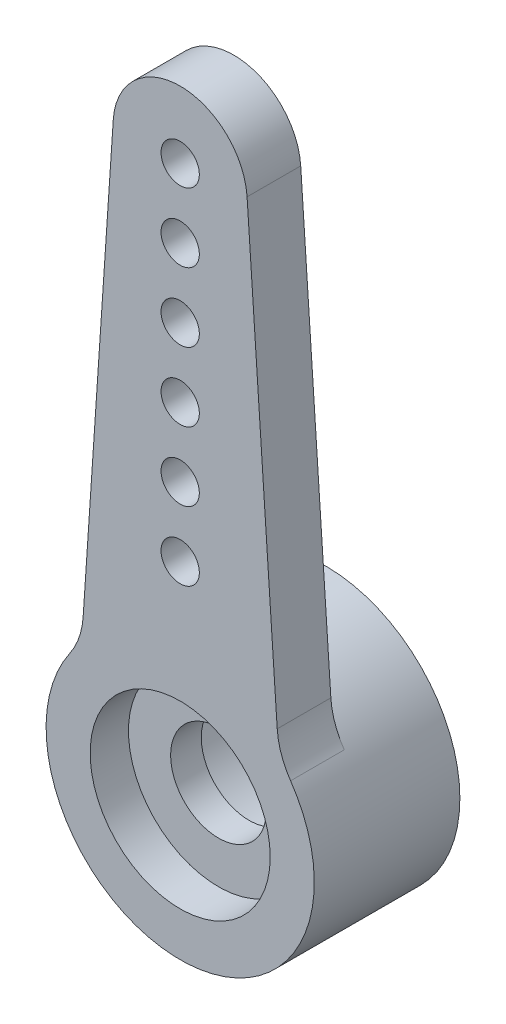
ISO-10303-21;
HEADER;
FILE_DESCRIPTION(('STEP AP214'),'2;1');
FILE_NAME('part.step','',(''),(''),'','','');
FILE_SCHEMA(('AUTOMOTIVE_DESIGN { 1 0 10303 214 1 1 1 1 }'));
ENDSEC;
DATA;
#1=APPLICATION_CONTEXT('core data for automotive mechanical design processes');
#2=APPLICATION_PROTOCOL_DEFINITION('international standard','automotive_design',2000,#1);
#3=PRODUCT_CONTEXT('',#1,'mechanical');
#4=PRODUCT('Part','Part','',(#3));
#5=PRODUCT_RELATED_PRODUCT_CATEGORY('part','',(#4));
#6=PRODUCT_DEFINITION_FORMATION('','',#4);
#7=PRODUCT_DEFINITION_CONTEXT('part definition',#1,'design');
#8=PRODUCT_DEFINITION('design','',#6,#7);
#9=PRODUCT_DEFINITION_SHAPE('','',#8);
#10=(LENGTH_UNIT() NAMED_UNIT(*) SI_UNIT(.MILLI.,.METRE.));
#11=(NAMED_UNIT(*) PLANE_ANGLE_UNIT() SI_UNIT($,.RADIAN.));
#12=(NAMED_UNIT(*) SI_UNIT($,.STERADIAN.) SOLID_ANGLE_UNIT());
#13=UNCERTAINTY_MEASURE_WITH_UNIT(LENGTH_MEASURE(1.E-05),#10,'distance_accuracy_value','');
#14=(GEOMETRIC_REPRESENTATION_CONTEXT(3) GLOBAL_UNCERTAINTY_ASSIGNED_CONTEXT((#13)) GLOBAL_UNIT_ASSIGNED_CONTEXT((#10,
#11,#12)) REPRESENTATION_CONTEXT('',''));
#15=CARTESIAN_POINT('',(0.,0.,0.));
#16=DIRECTION('',(0.,0.,1.));
#17=DIRECTION('',(1.,0.,0.));
#18=AXIS2_PLACEMENT_3D('',#15,#16,#17);
#19=CARTESIAN_POINT('',(0.,0.,3.8));
#20=DIRECTION('',(0.,0.,-1.));
#21=DIRECTION('',(-1.,0.,0.));
#22=AXIS2_PLACEMENT_3D('',#19,#20,#21);
#23=CYLINDRICAL_SURFACE('',#22,1.25);
#24=CARTESIAN_POINT('',(0.,0.,2.8));
#25=DIRECTION('',(0.,0.,1.));
#26=DIRECTION('',(1.,0.,0.));
#27=AXIS2_PLACEMENT_3D('',#24,#25,#26);
#28=CIRCLE('',#27,1.25);
#29=CARTESIAN_POINT('',(-1.25,0.,2.8));
#30=VERTEX_POINT('',#29);
#31=EDGE_CURVE('E148',#30,#30,#28,.T.);
#32=CARTESIAN_POINT('',(0.,0.,2.));
#33=DIRECTION('',(0.,0.,-1.));
#34=DIRECTION('',(-1.,0.,0.));
#35=AXIS2_PLACEMENT_3D('',#32,#33,#34);
#36=CIRCLE('',#35,1.25);
#37=CARTESIAN_POINT('',(-1.25,0.,2.));
#38=VERTEX_POINT('',#37);
#39=EDGE_CURVE('E154',#38,#38,#36,.T.);
#40=CARTESIAN_POINT('',(-1.25,0.,2.8));
#41=CARTESIAN_POINT('',(-1.25,0.,2.79166666666667));
#42=CARTESIAN_POINT('',(-1.25,0.,2.78333333333333));
#43=CARTESIAN_POINT('',(-1.25,0.,2.76666666666667));
#44=CARTESIAN_POINT('',(-1.25,0.,2.75833333333333));
#45=CARTESIAN_POINT('',(-1.25,0.,2.74166666666667));
#46=CARTESIAN_POINT('',(-1.25,0.,2.73333333333333));
#47=CARTESIAN_POINT('',(-1.25,0.,2.71666666666667));
#48=CARTESIAN_POINT('',(-1.25,0.,2.70833333333333));
#49=CARTESIAN_POINT('',(-1.25,0.,2.69166666666667));
#50=CARTESIAN_POINT('',(-1.25,0.,2.68333333333333));
#51=CARTESIAN_POINT('',(-1.25,0.,2.66666666666667));
#52=CARTESIAN_POINT('',(-1.25,0.,2.65833333333333));
#53=CARTESIAN_POINT('',(-1.25,0.,2.64166666666667));
#54=CARTESIAN_POINT('',(-1.25,0.,2.63333333333333));
#55=CARTESIAN_POINT('',(-1.25,0.,2.61666666666667));
#56=CARTESIAN_POINT('',(-1.25,0.,2.60833333333333));
#57=CARTESIAN_POINT('',(-1.25,0.,2.59166666666667));
#58=CARTESIAN_POINT('',(-1.25,0.,2.58333333333333));
#59=CARTESIAN_POINT('',(-1.25,0.,2.56666666666667));
#60=CARTESIAN_POINT('',(-1.25,0.,2.55833333333333));
#61=CARTESIAN_POINT('',(-1.25,0.,2.54166666666667));
#62=CARTESIAN_POINT('',(-1.25,0.,2.53333333333333));
#63=CARTESIAN_POINT('',(-1.25,0.,2.51666666666667));
#64=CARTESIAN_POINT('',(-1.25,0.,2.50833333333333));
#65=CARTESIAN_POINT('',(-1.25,0.,2.49166666666667));
#66=CARTESIAN_POINT('',(-1.25,0.,2.48333333333333));
#67=CARTESIAN_POINT('',(-1.25,0.,2.46666666666667));
#68=CARTESIAN_POINT('',(-1.25,0.,2.45833333333333));
#69=CARTESIAN_POINT('',(-1.25,0.,2.44166666666667));
#70=CARTESIAN_POINT('',(-1.25,0.,2.43333333333333));
#71=CARTESIAN_POINT('',(-1.25,0.,2.41666666666667));
#72=CARTESIAN_POINT('',(-1.25,0.,2.40833333333333));
#73=CARTESIAN_POINT('',(-1.25,0.,2.39166666666667));
#74=CARTESIAN_POINT('',(-1.25,0.,2.38333333333333));
#75=CARTESIAN_POINT('',(-1.25,0.,2.36666666666667));
#76=CARTESIAN_POINT('',(-1.25,0.,2.35833333333333));
#77=CARTESIAN_POINT('',(-1.25,0.,2.34166666666667));
#78=CARTESIAN_POINT('',(-1.25,0.,2.33333333333333));
#79=CARTESIAN_POINT('',(-1.25,0.,2.31666666666667));
#80=CARTESIAN_POINT('',(-1.25,0.,2.30833333333333));
#81=CARTESIAN_POINT('',(-1.25,0.,2.29166666666667));
#82=CARTESIAN_POINT('',(-1.25,0.,2.28333333333333));
#83=CARTESIAN_POINT('',(-1.25,0.,2.26666666666667));
#84=CARTESIAN_POINT('',(-1.25,0.,2.25833333333333));
#85=CARTESIAN_POINT('',(-1.25,0.,2.24166666666667));
#86=CARTESIAN_POINT('',(-1.25,0.,2.23333333333333));
#87=CARTESIAN_POINT('',(-1.25,0.,2.21666666666667));
#88=CARTESIAN_POINT('',(-1.25,0.,2.20833333333333));
#89=CARTESIAN_POINT('',(-1.25,0.,2.19166666666667));
#90=CARTESIAN_POINT('',(-1.25,0.,2.18333333333333));
#91=CARTESIAN_POINT('',(-1.25,0.,2.16666666666667));
#92=CARTESIAN_POINT('',(-1.25,0.,2.15833333333333));
#93=CARTESIAN_POINT('',(-1.25,0.,2.14166666666667));
#94=CARTESIAN_POINT('',(-1.25,0.,2.13333333333333));
#95=CARTESIAN_POINT('',(-1.25,0.,2.11666666666667));
#96=CARTESIAN_POINT('',(-1.25,0.,2.10833333333333));
#97=CARTESIAN_POINT('',(-1.25,0.,2.09166666666667));
#98=CARTESIAN_POINT('',(-1.25,0.,2.08333333333333));
#99=CARTESIAN_POINT('',(-1.25,0.,2.06666666666667));
#100=CARTESIAN_POINT('',(-1.25,0.,2.05833333333333));
#101=CARTESIAN_POINT('',(-1.25,0.,2.04166666666667));
#102=CARTESIAN_POINT('',(-1.25,0.,2.03333333333333));
#103=CARTESIAN_POINT('',(-1.25,0.,2.01666666666667));
#104=CARTESIAN_POINT('',(-1.25,0.,2.00833333333333));
#105=CARTESIAN_POINT('',(-1.25,0.,2.));
#106=B_SPLINE_CURVE_WITH_KNOTS('',3,(#40,#41,#42,#43,#44,#45,#46,#47,#48,#49,#50,#51,#52,#53,
#54,#55,#56,#57,#58,#59,#60,#61,#62,#63,#64,#65,#66,#67,#68,#69,#70,#71,#72,#73,#74,#75,#76,#77,
#78,#79,#80,#81,#82,#83,#84,#85,#86,#87,#88,#89,#90,#91,#92,#93,#94,#95,#96,#97,#98,#99,#100,
#101,#102,#103,#104,#105),.UNSPECIFIED.,.F.,.F.,(4,2,2,2,2,2,2,2,2,2,2,2,2,2,2,2,2,2,2,2,2,2,2,
2,2,2,2,2,2,2,2,2,4),(0.,0.0249999999999998,0.0499999999999997,0.0749999999999995,
0.0999999999999994,0.125,0.15,0.175,0.2,0.225,0.249999999999999,0.275,0.3,0.325,0.35,
0.374999999999999,0.399999999999999,0.424999999999999,0.449999999999999,0.475,0.5,
0.524999999999999,0.549999999999999,0.574999999999999,0.599999999999999,0.625,0.65,
0.674999999999999,0.699999999999999,0.724999999999999,0.749999999999999,0.775,
0.799999999999999),.UNSPECIFIED.);
#107=EDGE_CURVE('BSEAM39',#30,#38,#106,.T.);
#108=ORIENTED_EDGE('',*,*,#31,.T.);
#109=ORIENTED_EDGE('',*,*,#39,.T.);
#110=ORIENTED_EDGE('',*,*,#107,.T.);
#111=ORIENTED_EDGE('',*,*,#107,.F.);
#112=EDGE_LOOP('',(#108,#110,#109,#111));
#113=FACE_BOUND('',#112,.T.);
#114=ADVANCED_FACE('F39',(#113),#23,.F.);
#115=CARTESIAN_POINT('',(0.,0.,3.8));
#116=DIRECTION('',(0.,0.,1.));
#117=DIRECTION('',(1.,0.,0.));
#118=AXIS2_PLACEMENT_3D('',#115,#116,#117);
#119=PLANE('',#118);
#120=CARTESIAN_POINT('',(0.,0.,3.8));
#121=DIRECTION('',(0.,0.,1.));
#122=DIRECTION('',(1.,0.,0.));
#123=AXIS2_PLACEMENT_3D('',#120,#121,#122);
#124=CIRCLE('',#123,2.35);
#125=CARTESIAN_POINT('',(2.35,0.,3.8));
#126=VERTEX_POINT('',#125);
#127=EDGE_CURVE('E158',#126,#126,#124,.T.);
#128=ORIENTED_EDGE('',*,*,#127,.F.);
#129=EDGE_LOOP('',(#128));
#130=FACE_BOUND('',#129,.T.);
#131=DIRECTION('',(-0.0674688051263375,-0.997721384122253,0.));
#132=VECTOR('',#131,1.);
#133=CARTESIAN_POINT('',(-2.65,1.25,3.8));
#134=LINE('',#133,#132);
#135=CARTESIAN_POINT('',(-1.74601242221394,14.6180704089711,3.8));
#136=VERTEX_POINT('',#135);
#137=CARTESIAN_POINT('',(-2.53252839434501,2.98715738361887,3.8));
#138=VERTEX_POINT('',#137);
#139=EDGE_CURVE('E98',#136,#138,#134,.T.);
#140=ORIENTED_EDGE('',*,*,#139,.T.);
#141=CARTESIAN_POINT('',(-4.52797116258952,3.12209499387154,3.8));
#142=DIRECTION('',(0.,0.,1.));
#143=DIRECTION('',(1.,0.,0.));
#144=AXIS2_PLACEMENT_3D('',#141,#142,#143);
#145=CIRCLE('',#144,2.);
#146=CARTESIAN_POINT('',(-2.88143619437515,1.9867877233728,3.8));
#147=VERTEX_POINT('',#146);
#148=EDGE_CURVE('E174',#138,#147,#145,.F.);
#149=ORIENTED_EDGE('',*,*,#148,.T.);
#150=CARTESIAN_POINT('',(0.,0.,3.8));
#151=DIRECTION('',(0.,0.,1.));
#152=DIRECTION('',(1.,0.,0.));
#153=AXIS2_PLACEMENT_3D('',#150,#151,#152);
#154=CIRCLE('',#153,3.5);
#155=CARTESIAN_POINT('',(2.88143619437515,1.9867877233728,3.8));
#156=VERTEX_POINT('',#155);
#157=EDGE_CURVE('E141',#147,#156,#154,.T.);
#158=ORIENTED_EDGE('',*,*,#157,.T.);
#159=CARTESIAN_POINT('',(4.52797116258952,3.12209499387154,3.8));
#160=DIRECTION('',(0.,0.,1.));
#161=DIRECTION('',(1.,0.,0.));
#162=AXIS2_PLACEMENT_3D('',#159,#160,#161);
#163=CIRCLE('',#162,2.);
#164=CARTESIAN_POINT('',(2.53252839434501,2.98715738361887,3.8));
#165=VERTEX_POINT('',#164);
#166=EDGE_CURVE('E48',#156,#165,#163,.F.);
#167=ORIENTED_EDGE('',*,*,#166,.T.);
#168=DIRECTION('',(-0.0674688051263375,0.997721384122253,0.));
#169=VECTOR('',#168,1.);
#170=CARTESIAN_POINT('',(2.65,1.25,3.8));
#171=LINE('',#170,#169);
#172=CARTESIAN_POINT('',(1.74601242221394,14.6180704089711,3.8));
#173=VERTEX_POINT('',#172);
#174=EDGE_CURVE('E119',#165,#173,#171,.T.);
#175=ORIENTED_EDGE('',*,*,#174,.T.);
#176=CARTESIAN_POINT('',(0.,14.5,3.8));
#177=DIRECTION('',(0.,0.,1.));
#178=DIRECTION('',(1.,0.,0.));
#179=AXIS2_PLACEMENT_3D('',#176,#177,#178);
#180=CIRCLE('',#179,1.75);
#181=EDGE_CURVE('E129',#173,#136,#180,.T.);
#182=ORIENTED_EDGE('',*,*,#181,.T.);
#183=EDGE_LOOP('',(#140,#149,#158,#167,#175,#182));
#184=FACE_BOUND('',#183,.T.);
#185=CARTESIAN_POINT('',(1.00995535406375E-13,5.5,3.8));
#186=DIRECTION('',(0.,0.,1.));
#187=DIRECTION('',(1.,0.,0.));
#188=AXIS2_PLACEMENT_3D('',#185,#186,#187);
#189=CIRCLE('',#188,0.5);
#190=CARTESIAN_POINT('',(0.500000000000101,5.5,3.8));
#191=VERTEX_POINT('',#190);
#192=EDGE_CURVE('E152',#191,#191,#189,.T.);
#193=ORIENTED_EDGE('',*,*,#192,.F.);
#194=EDGE_LOOP('',(#193));
#195=FACE_BOUND('',#194,.T.);
#196=CARTESIAN_POINT('',(0.,7.3,3.8));
#197=DIRECTION('',(0.,0.,1.));
#198=DIRECTION('',(1.,0.,0.));
#199=AXIS2_PLACEMENT_3D('',#196,#197,#198);
#200=CIRCLE('',#199,0.5);
#201=CARTESIAN_POINT('',(0.500000000000076,7.3,3.8));
#202=VERTEX_POINT('',#201);
#203=EDGE_CURVE('E284',#202,#202,#200,.T.);
#204=ORIENTED_EDGE('',*,*,#203,.F.);
#205=EDGE_LOOP('',(#204));
#206=FACE_BOUND('',#205,.T.);
#207=CARTESIAN_POINT('',(0.,9.1,3.8));
#208=DIRECTION('',(0.,0.,1.));
#209=DIRECTION('',(1.,0.,0.));
#210=AXIS2_PLACEMENT_3D('',#207,#208,#209);
#211=CIRCLE('',#210,0.5);
#212=CARTESIAN_POINT('',(0.500000000000051,9.1,3.8));
#213=VERTEX_POINT('',#212);
#214=EDGE_CURVE('E292',#213,#213,#211,.T.);
#215=ORIENTED_EDGE('',*,*,#214,.F.);
#216=EDGE_LOOP('',(#215));
#217=FACE_BOUND('',#216,.T.);
#218=CARTESIAN_POINT('',(0.,10.9,3.8));
#219=DIRECTION('',(0.,0.,1.));
#220=DIRECTION('',(1.,0.,0.));
#221=AXIS2_PLACEMENT_3D('',#218,#219,#220);
#222=CIRCLE('',#221,0.5);
#223=CARTESIAN_POINT('',(0.500000000000026,10.9,3.8));
#224=VERTEX_POINT('',#223);
#225=EDGE_CURVE('E300',#224,#224,#222,.T.);
#226=ORIENTED_EDGE('',*,*,#225,.F.);
#227=EDGE_LOOP('',(#226));
#228=FACE_BOUND('',#227,.T.);
#229=CARTESIAN_POINT('',(0.,12.7,3.8));
#230=DIRECTION('',(0.,0.,1.));
#231=DIRECTION('',(1.,0.,0.));
#232=AXIS2_PLACEMENT_3D('',#229,#230,#231);
#233=CIRCLE('',#232,0.5);
#234=CARTESIAN_POINT('',(0.5,12.7,3.8));
#235=VERTEX_POINT('',#234);
#236=EDGE_CURVE('E308',#235,#235,#233,.T.);
#237=ORIENTED_EDGE('',*,*,#236,.F.);
#238=EDGE_LOOP('',(#237));
#239=FACE_BOUND('',#238,.T.);
#240=CARTESIAN_POINT('',(0.,14.5,3.8));
#241=DIRECTION('',(0.,0.,1.));
#242=DIRECTION('',(1.,0.,0.));
#243=AXIS2_PLACEMENT_3D('',#240,#241,#242);
#244=CIRCLE('',#243,0.5);
#245=CARTESIAN_POINT('',(0.5,14.5,3.8));
#246=VERTEX_POINT('',#245);
#247=EDGE_CURVE('E124',#246,#246,#244,.T.);
#248=ORIENTED_EDGE('',*,*,#247,.F.);
#249=EDGE_LOOP('',(#248));
#250=FACE_BOUND('',#249,.T.);
#251=ADVANCED_FACE('F179',(#130,#184,#195,#206,#217,#228,#239,#250),#119,.T.);
#252=CARTESIAN_POINT('',(0.,0.,0.));
#253=DIRECTION('',(0.,0.,1.));
#254=DIRECTION('',(1.,0.,0.));
#255=AXIS2_PLACEMENT_3D('',#252,#253,#254);
#256=PLANE('',#255);
#257=CARTESIAN_POINT('',(0.,0.,0.));
#258=DIRECTION('',(0.,0.,-1.));
#259=DIRECTION('',(-1.,0.,0.));
#260=AXIS2_PLACEMENT_3D('',#257,#258,#259);
#261=CIRCLE('',#260,2.35);
#262=CARTESIAN_POINT('',(-2.35,0.,0.));
#263=VERTEX_POINT('',#262);
#264=EDGE_CURVE('E268',#263,#263,#261,.T.);
#265=ORIENTED_EDGE('',*,*,#264,.F.);
#266=EDGE_LOOP('',(#265));
#267=FACE_BOUND('',#266,.T.);
#268=CARTESIAN_POINT('',(0.,0.,0.));
#269=DIRECTION('',(0.,0.,1.));
#270=DIRECTION('',(1.,0.,0.));
#271=AXIS2_PLACEMENT_3D('',#268,#269,#270);
#272=CIRCLE('',#271,3.5);
#273=CARTESIAN_POINT('',(3.5,0.,0.));
#274=VERTEX_POINT('',#273);
#275=EDGE_CURVE('E140',#274,#274,#272,.T.);
#276=ORIENTED_EDGE('',*,*,#275,.F.);
#277=EDGE_LOOP('',(#276));
#278=FACE_BOUND('',#277,.T.);
#279=ADVANCED_FACE('F205',(#267,#278),#256,.F.);
#280=CARTESIAN_POINT('',(0.,0.,3.8));
#281=DIRECTION('',(0.,0.,-1.));
#282=DIRECTION('',(-1.,0.,0.));
#283=AXIS2_PLACEMENT_3D('',#280,#281,#282);
#284=CYLINDRICAL_SURFACE('',#283,3.5);
#285=ORIENTED_EDGE('',*,*,#157,.F.);
#286=DIRECTION('',(0.,0.,-1.));
#287=VECTOR('',#286,1.);
#288=CARTESIAN_POINT('',(-2.88143619437515,1.9867877233728,3.8));
#289=LINE('',#288,#287);
#290=CARTESIAN_POINT('',(-2.88143619437515,1.9867877233728,2.4));
#291=VERTEX_POINT('',#290);
#292=EDGE_CURVE('E163',#147,#291,#289,.T.);
#293=ORIENTED_EDGE('',*,*,#292,.T.);
#294=CARTESIAN_POINT('',(0.,0.,2.4));
#295=DIRECTION('',(0.,0.,1.));
#296=DIRECTION('',(1.,0.,0.));
#297=AXIS2_PLACEMENT_3D('',#294,#295,#296);
#298=CIRCLE('',#297,3.5);
#299=CARTESIAN_POINT('',(2.88143619437515,1.9867877233728,2.4));
#300=VERTEX_POINT('',#299);
#301=EDGE_CURVE('E136',#300,#291,#298,.T.);
#302=ORIENTED_EDGE('',*,*,#301,.F.);
#303=DIRECTION('',(0.,0.,-1.));
#304=VECTOR('',#303,1.);
#305=CARTESIAN_POINT('',(2.88143619437515,1.9867877233728,3.8));
#306=LINE('',#305,#304);
#307=EDGE_CURVE('E144',#300,#156,#306,.F.);
#308=ORIENTED_EDGE('',*,*,#307,.T.);
#309=EDGE_LOOP('',(#285,#293,#302,#308));
#310=FACE_BOUND('',#309,.T.);
#311=ORIENTED_EDGE('',*,*,#275,.T.);
#312=EDGE_LOOP('',(#311));
#313=FACE_BOUND('',#312,.T.);
#314=ADVANCED_FACE('F184',(#310,#313),#284,.T.);
#315=CARTESIAN_POINT('',(2.65,1.25,2.4));
#316=DIRECTION('',(0.997721384122253,0.0674688051263375,0.));
#317=DIRECTION('',(-0.0674688051263375,0.997721384122253,0.));
#318=AXIS2_PLACEMENT_3D('',#315,#316,#317);
#319=PLANE('',#318);
#320=ORIENTED_EDGE('',*,*,#174,.F.);
#321=DIRECTION('',(0.,0.,-1.));
#322=VECTOR('',#321,1.);
#323=CARTESIAN_POINT('',(2.53252839434501,2.98715738361887,2.4));
#324=LINE('',#323,#322);
#325=CARTESIAN_POINT('',(2.53252839434501,2.98715738361887,2.4));
#326=VERTEX_POINT('',#325);
#327=EDGE_CURVE('E61',#165,#326,#324,.T.);
#328=ORIENTED_EDGE('',*,*,#327,.T.);
#329=DIRECTION('',(-0.0674688051263375,0.997721384122253,0.));
#330=VECTOR('',#329,1.);
#331=CARTESIAN_POINT('',(2.65,1.25,2.4));
#332=LINE('',#331,#330);
#333=CARTESIAN_POINT('',(1.74601242221394,14.6180704089711,2.4));
#334=VERTEX_POINT('',#333);
#335=EDGE_CURVE('E105',#326,#334,#332,.T.);
#336=ORIENTED_EDGE('',*,*,#335,.T.);
#337=DIRECTION('',(0.,0.,1.));
#338=VECTOR('',#337,1.);
#339=CARTESIAN_POINT('',(1.74601242221394,14.6180704089711,2.4));
#340=LINE('',#339,#338);
#341=EDGE_CURVE('E104',#334,#173,#340,.T.);
#342=ORIENTED_EDGE('',*,*,#341,.T.);
#343=EDGE_LOOP('',(#320,#328,#336,#342));
#344=FACE_BOUND('',#343,.T.);
#345=ADVANCED_FACE('F215',(#344),#319,.T.);
#346=CARTESIAN_POINT('',(-2.65,1.25,2.4));
#347=DIRECTION('',(-0.997721384122253,0.0674688051263375,0.));
#348=DIRECTION('',(-0.0674688051263375,-0.997721384122253,0.));
#349=AXIS2_PLACEMENT_3D('',#346,#347,#348);
#350=PLANE('',#349);
#351=DIRECTION('',(-0.0674688051263375,-0.997721384122253,0.));
#352=VECTOR('',#351,1.);
#353=CARTESIAN_POINT('',(-2.65,1.25,2.4));
#354=LINE('',#353,#352);
#355=CARTESIAN_POINT('',(-1.74601242221394,14.6180704089711,2.4));
#356=VERTEX_POINT('',#355);
#357=CARTESIAN_POINT('',(-2.53252839434501,2.98715738361887,2.4));
#358=VERTEX_POINT('',#357);
#359=EDGE_CURVE('E95',#356,#358,#354,.T.);
#360=ORIENTED_EDGE('',*,*,#359,.T.);
#361=DIRECTION('',(0.,0.,-1.));
#362=VECTOR('',#361,1.);
#363=CARTESIAN_POINT('',(-2.53252839434501,2.98715738361887,2.4));
#364=LINE('',#363,#362);
#365=EDGE_CURVE('E167',#358,#138,#364,.F.);
#366=ORIENTED_EDGE('',*,*,#365,.T.);
#367=ORIENTED_EDGE('',*,*,#139,.F.);
#368=DIRECTION('',(0.,0.,1.));
#369=VECTOR('',#368,1.);
#370=CARTESIAN_POINT('',(-1.74601242221394,14.6180704089711,2.4));
#371=LINE('',#370,#369);
#372=EDGE_CURVE('E92',#356,#136,#371,.T.);
#373=ORIENTED_EDGE('',*,*,#372,.F.);
#374=EDGE_LOOP('',(#360,#366,#367,#373));
#375=FACE_BOUND('',#374,.T.);
#376=ADVANCED_FACE('F94',(#375),#350,.T.);
#377=CARTESIAN_POINT('',(0.,14.5,2.4));
#378=DIRECTION('',(0.,0.,1.));
#379=DIRECTION('',(1.,0.,0.));
#380=AXIS2_PLACEMENT_3D('',#377,#378,#379);
#381=CYLINDRICAL_SURFACE('',#380,1.75);
#382=ORIENTED_EDGE('',*,*,#181,.F.);
#383=ORIENTED_EDGE('',*,*,#341,.F.);
#384=CARTESIAN_POINT('',(0.,14.5,2.4));
#385=DIRECTION('',(0.,0.,1.));
#386=DIRECTION('',(1.,0.,0.));
#387=AXIS2_PLACEMENT_3D('',#384,#385,#386);
#388=CIRCLE('',#387,1.75);
#389=EDGE_CURVE('E110',#334,#356,#388,.T.);
#390=ORIENTED_EDGE('',*,*,#389,.T.);
#391=ORIENTED_EDGE('',*,*,#372,.T.);
#392=EDGE_LOOP('',(#382,#383,#390,#391));
#393=FACE_BOUND('',#392,.T.);
#394=ADVANCED_FACE('F116',(#393),#381,.T.);
#395=CARTESIAN_POINT('',(0.,14.5,2.4));
#396=DIRECTION('',(0.,0.,1.));
#397=DIRECTION('',(1.,0.,0.));
#398=AXIS2_PLACEMENT_3D('',#395,#396,#397);
#399=PLANE('',#398);
#400=CARTESIAN_POINT('',(1.00995535406375E-13,5.5,2.4));
#401=DIRECTION('',(0.,0.,1.));
#402=DIRECTION('',(1.,0.,0.));
#403=AXIS2_PLACEMENT_3D('',#400,#401,#402);
#404=CIRCLE('',#403,0.5);
#405=CARTESIAN_POINT('',(0.500000000000101,5.5,2.4));
#406=VERTEX_POINT('',#405);
#407=EDGE_CURVE('E280',#406,#406,#404,.T.);
#408=ORIENTED_EDGE('',*,*,#407,.T.);
#409=EDGE_LOOP('',(#408));
#410=FACE_BOUND('',#409,.T.);
#411=CARTESIAN_POINT('',(0.,7.3,2.4));
#412=DIRECTION('',(0.,0.,1.));
#413=DIRECTION('',(1.,0.,0.));
#414=AXIS2_PLACEMENT_3D('',#411,#412,#413);
#415=CIRCLE('',#414,0.5);
#416=CARTESIAN_POINT('',(0.500000000000076,7.3,2.4));
#417=VERTEX_POINT('',#416);
#418=EDGE_CURVE('E288',#417,#417,#415,.T.);
#419=ORIENTED_EDGE('',*,*,#418,.T.);
#420=EDGE_LOOP('',(#419));
#421=FACE_BOUND('',#420,.T.);
#422=CARTESIAN_POINT('',(0.,9.1,2.4));
#423=DIRECTION('',(0.,0.,1.));
#424=DIRECTION('',(1.,0.,0.));
#425=AXIS2_PLACEMENT_3D('',#422,#423,#424);
#426=CIRCLE('',#425,0.5);
#427=CARTESIAN_POINT('',(0.500000000000051,9.1,2.4));
#428=VERTEX_POINT('',#427);
#429=EDGE_CURVE('E296',#428,#428,#426,.T.);
#430=ORIENTED_EDGE('',*,*,#429,.T.);
#431=EDGE_LOOP('',(#430));
#432=FACE_BOUND('',#431,.T.);
#433=CARTESIAN_POINT('',(0.,10.9,2.4));
#434=DIRECTION('',(0.,0.,1.));
#435=DIRECTION('',(1.,0.,0.));
#436=AXIS2_PLACEMENT_3D('',#433,#434,#435);
#437=CIRCLE('',#436,0.5);
#438=CARTESIAN_POINT('',(0.500000000000026,10.9,2.4));
#439=VERTEX_POINT('',#438);
#440=EDGE_CURVE('E304',#439,#439,#437,.T.);
#441=ORIENTED_EDGE('',*,*,#440,.T.);
#442=EDGE_LOOP('',(#441));
#443=FACE_BOUND('',#442,.T.);
#444=CARTESIAN_POINT('',(0.,12.7,2.4));
#445=DIRECTION('',(0.,0.,1.));
#446=DIRECTION('',(1.,0.,0.));
#447=AXIS2_PLACEMENT_3D('',#444,#445,#446);
#448=CIRCLE('',#447,0.5);
#449=CARTESIAN_POINT('',(0.5,12.7,2.4));
#450=VERTEX_POINT('',#449);
#451=EDGE_CURVE('E312',#450,#450,#448,.T.);
#452=ORIENTED_EDGE('',*,*,#451,.T.);
#453=EDGE_LOOP('',(#452));
#454=FACE_BOUND('',#453,.T.);
#455=CARTESIAN_POINT('',(0.,14.5,2.4));
#456=DIRECTION('',(0.,0.,1.));
#457=DIRECTION('',(1.,0.,0.));
#458=AXIS2_PLACEMENT_3D('',#455,#456,#457);
#459=CIRCLE('',#458,0.5);
#460=CARTESIAN_POINT('',(0.5,14.5,2.4));
#461=VERTEX_POINT('',#460);
#462=EDGE_CURVE('E132',#461,#461,#459,.T.);
#463=ORIENTED_EDGE('',*,*,#462,.T.);
#464=EDGE_LOOP('',(#463));
#465=FACE_BOUND('',#464,.T.);
#466=ORIENTED_EDGE('',*,*,#335,.F.);
#467=CARTESIAN_POINT('',(4.52797116258952,3.12209499387154,2.4));
#468=DIRECTION('',(0.,0.,1.));
#469=DIRECTION('',(1.,0.,0.));
#470=AXIS2_PLACEMENT_3D('',#467,#468,#469);
#471=CIRCLE('',#470,2.);
#472=EDGE_CURVE('E11',#326,#300,#471,.T.);
#473=ORIENTED_EDGE('',*,*,#472,.T.);
#474=ORIENTED_EDGE('',*,*,#301,.T.);
#475=CARTESIAN_POINT('',(-4.52797116258952,3.12209499387154,2.4));
#476=DIRECTION('',(0.,0.,1.));
#477=DIRECTION('',(1.,0.,0.));
#478=AXIS2_PLACEMENT_3D('',#475,#476,#477);
#479=CIRCLE('',#478,2.);
#480=EDGE_CURVE('E112',#291,#358,#479,.T.);
#481=ORIENTED_EDGE('',*,*,#480,.T.);
#482=ORIENTED_EDGE('',*,*,#359,.F.);
#483=ORIENTED_EDGE('',*,*,#389,.F.);
#484=EDGE_LOOP('',(#466,#473,#474,#481,#482,#483));
#485=FACE_BOUND('',#484,.T.);
#486=ADVANCED_FACE('F109',(#410,#421,#432,#443,#454,#465,#485),#399,.F.);
#487=CARTESIAN_POINT('',(0.,14.5,2.4));
#488=DIRECTION('',(0.,0.,1.));
#489=DIRECTION('',(1.,0.,0.));
#490=AXIS2_PLACEMENT_3D('',#487,#488,#489);
#491=CYLINDRICAL_SURFACE('',#490,0.5);
#492=ORIENTED_EDGE('',*,*,#462,.F.);
#493=EDGE_LOOP('',(#492));
#494=FACE_BOUND('',#493,.T.);
#495=ORIENTED_EDGE('',*,*,#247,.T.);
#496=EDGE_LOOP('',(#495));
#497=FACE_BOUND('',#496,.T.);
#498=ADVANCED_FACE('F226',(#494,#497),#491,.F.);
#499=CARTESIAN_POINT('',(0.,12.7,2.4));
#500=DIRECTION('',(0.,0.,1.));
#501=DIRECTION('',(1.,0.,0.));
#502=AXIS2_PLACEMENT_3D('',#499,#500,#501);
#503=CYLINDRICAL_SURFACE('',#502,0.5);
#504=ORIENTED_EDGE('',*,*,#451,.F.);
#505=EDGE_LOOP('',(#504));
#506=FACE_BOUND('',#505,.T.);
#507=ORIENTED_EDGE('',*,*,#236,.T.);
#508=EDGE_LOOP('',(#507));
#509=FACE_BOUND('',#508,.T.);
#510=ADVANCED_FACE('F230',(#506,#509),#503,.F.);
#511=CARTESIAN_POINT('',(0.,10.9,2.4));
#512=DIRECTION('',(0.,0.,1.));
#513=DIRECTION('',(1.,0.,0.));
#514=AXIS2_PLACEMENT_3D('',#511,#512,#513);
#515=CYLINDRICAL_SURFACE('',#514,0.5);
#516=ORIENTED_EDGE('',*,*,#440,.F.);
#517=EDGE_LOOP('',(#516));
#518=FACE_BOUND('',#517,.T.);
#519=ORIENTED_EDGE('',*,*,#225,.T.);
#520=EDGE_LOOP('',(#519));
#521=FACE_BOUND('',#520,.T.);
#522=ADVANCED_FACE('F234',(#518,#521),#515,.F.);
#523=CARTESIAN_POINT('',(0.,9.1,2.4));
#524=DIRECTION('',(0.,0.,1.));
#525=DIRECTION('',(1.,0.,0.));
#526=AXIS2_PLACEMENT_3D('',#523,#524,#525);
#527=CYLINDRICAL_SURFACE('',#526,0.5);
#528=ORIENTED_EDGE('',*,*,#429,.F.);
#529=EDGE_LOOP('',(#528));
#530=FACE_BOUND('',#529,.T.);
#531=ORIENTED_EDGE('',*,*,#214,.T.);
#532=EDGE_LOOP('',(#531));
#533=FACE_BOUND('',#532,.T.);
#534=ADVANCED_FACE('F238',(#530,#533),#527,.F.);
#535=CARTESIAN_POINT('',(0.,7.3,2.4));
#536=DIRECTION('',(0.,0.,1.));
#537=DIRECTION('',(1.,0.,0.));
#538=AXIS2_PLACEMENT_3D('',#535,#536,#537);
#539=CYLINDRICAL_SURFACE('',#538,0.5);
#540=ORIENTED_EDGE('',*,*,#418,.F.);
#541=EDGE_LOOP('',(#540));
#542=FACE_BOUND('',#541,.T.);
#543=ORIENTED_EDGE('',*,*,#203,.T.);
#544=EDGE_LOOP('',(#543));
#545=FACE_BOUND('',#544,.T.);
#546=ADVANCED_FACE('F242',(#542,#545),#539,.F.);
#547=CARTESIAN_POINT('',(1.00995535406375E-13,5.5,2.4));
#548=DIRECTION('',(0.,0.,1.));
#549=DIRECTION('',(1.,0.,0.));
#550=AXIS2_PLACEMENT_3D('',#547,#548,#549);
#551=CYLINDRICAL_SURFACE('',#550,0.5);
#552=ORIENTED_EDGE('',*,*,#407,.F.);
#553=EDGE_LOOP('',(#552));
#554=FACE_BOUND('',#553,.T.);
#555=ORIENTED_EDGE('',*,*,#192,.T.);
#556=EDGE_LOOP('',(#555));
#557=FACE_BOUND('',#556,.T.);
#558=ADVANCED_FACE('F246',(#554,#557),#551,.F.);
#559=CARTESIAN_POINT('',(0.,0.,2.8));
#560=DIRECTION('',(0.,0.,1.));
#561=DIRECTION('',(1.,0.,0.));
#562=AXIS2_PLACEMENT_3D('',#559,#560,#561);
#563=CYLINDRICAL_SURFACE('',#562,2.35);
#564=CARTESIAN_POINT('',(0.,0.,2.8));
#565=DIRECTION('',(0.,0.,1.));
#566=DIRECTION('',(1.,0.,0.));
#567=AXIS2_PLACEMENT_3D('',#564,#565,#566);
#568=CIRCLE('',#567,2.35);
#569=CARTESIAN_POINT('',(2.35,0.,2.8));
#570=VERTEX_POINT('',#569);
#571=EDGE_CURVE('E153',#570,#570,#568,.T.);
#572=ORIENTED_EDGE('',*,*,#571,.F.);
#573=EDGE_LOOP('',(#572));
#574=FACE_BOUND('',#573,.T.);
#575=ORIENTED_EDGE('',*,*,#127,.T.);
#576=EDGE_LOOP('',(#575));
#577=FACE_BOUND('',#576,.T.);
#578=ADVANCED_FACE('F250',(#574,#577),#563,.F.);
#579=CARTESIAN_POINT('',(0.,0.,2.8));
#580=DIRECTION('',(0.,0.,1.));
#581=DIRECTION('',(1.,0.,0.));
#582=AXIS2_PLACEMENT_3D('',#579,#580,#581);
#583=PLANE('',#582);
#584=ORIENTED_EDGE('',*,*,#31,.F.);
#585=EDGE_LOOP('',(#584));
#586=FACE_BOUND('',#585,.T.);
#587=ORIENTED_EDGE('',*,*,#571,.T.);
#588=EDGE_LOOP('',(#587));
#589=FACE_BOUND('',#588,.T.);
#590=ADVANCED_FACE('F254',(#586,#589),#583,.T.);
#591=CARTESIAN_POINT('',(0.,0.,2.));
#592=DIRECTION('',(0.,0.,-1.));
#593=DIRECTION('',(-1.,0.,0.));
#594=AXIS2_PLACEMENT_3D('',#591,#592,#593);
#595=CYLINDRICAL_SURFACE('',#594,2.35);
#596=CARTESIAN_POINT('',(0.,0.,2.));
#597=DIRECTION('',(0.,0.,-1.));
#598=DIRECTION('',(-1.,0.,0.));
#599=AXIS2_PLACEMENT_3D('',#596,#597,#598);
#600=CIRCLE('',#599,2.35);
#601=CARTESIAN_POINT('',(-2.35,0.,2.));
#602=VERTEX_POINT('',#601);
#603=EDGE_CURVE('E159',#602,#602,#600,.T.);
#604=ORIENTED_EDGE('',*,*,#603,.F.);
#605=EDGE_LOOP('',(#604));
#606=FACE_BOUND('',#605,.T.);
#607=ORIENTED_EDGE('',*,*,#264,.T.);
#608=EDGE_LOOP('',(#607));
#609=FACE_BOUND('',#608,.T.);
#610=ADVANCED_FACE('F195',(#606,#609),#595,.F.);
#611=CARTESIAN_POINT('',(0.,0.,2.));
#612=DIRECTION('',(0.,0.,-1.));
#613=DIRECTION('',(-1.,0.,0.));
#614=AXIS2_PLACEMENT_3D('',#611,#612,#613);
#615=PLANE('',#614);
#616=ORIENTED_EDGE('',*,*,#39,.F.);
#617=EDGE_LOOP('',(#616));
#618=FACE_BOUND('',#617,.T.);
#619=ORIENTED_EDGE('',*,*,#603,.T.);
#620=EDGE_LOOP('',(#619));
#621=FACE_BOUND('',#620,.T.);
#622=ADVANCED_FACE('F189',(#618,#621),#615,.T.);
#623=CARTESIAN_POINT('',(-4.52797116258952,3.12209499387154,3.8));
#624=DIRECTION('',(0.,0.,-1.));
#625=DIRECTION('',(-1.,0.,0.));
#626=AXIS2_PLACEMENT_3D('',#623,#624,#625);
#627=CYLINDRICAL_SURFACE('',#626,2.);
#628=ORIENTED_EDGE('',*,*,#148,.F.);
#629=ORIENTED_EDGE('',*,*,#365,.F.);
#630=ORIENTED_EDGE('',*,*,#480,.F.);
#631=ORIENTED_EDGE('',*,*,#292,.F.);
#632=EDGE_LOOP('',(#628,#629,#630,#631));
#633=FACE_BOUND('',#632,.T.);
#634=ADVANCED_FACE('F187',(#633),#627,.F.);
#635=CARTESIAN_POINT('',(4.52797116258952,3.12209499387154,3.8));
#636=DIRECTION('',(0.,0.,-1.));
#637=DIRECTION('',(-1.,0.,0.));
#638=AXIS2_PLACEMENT_3D('',#635,#636,#637);
#639=CYLINDRICAL_SURFACE('',#638,2.);
#640=ORIENTED_EDGE('',*,*,#472,.F.);
#641=ORIENTED_EDGE('',*,*,#327,.F.);
#642=ORIENTED_EDGE('',*,*,#166,.F.);
#643=ORIENTED_EDGE('',*,*,#307,.F.);
#644=EDGE_LOOP('',(#640,#641,#642,#643));
#645=FACE_BOUND('',#644,.T.);
#646=ADVANCED_FACE('F41',(#645),#639,.F.);
#647=CLOSED_SHELL('',(#114,#251,#279,#314,#345,#376,#394,#486,#498,#510,#522,#534,#546,#558,
#578,#590,#610,#622,#634,#646));
#648=MANIFOLD_SOLID_BREP('B2',#647);
#649=ADVANCED_BREP_SHAPE_REPRESENTATION('',(#18,#648),#14);
#650=SHAPE_DEFINITION_REPRESENTATION(#9,#649);
ENDSEC;
END-ISO-10303-21;
